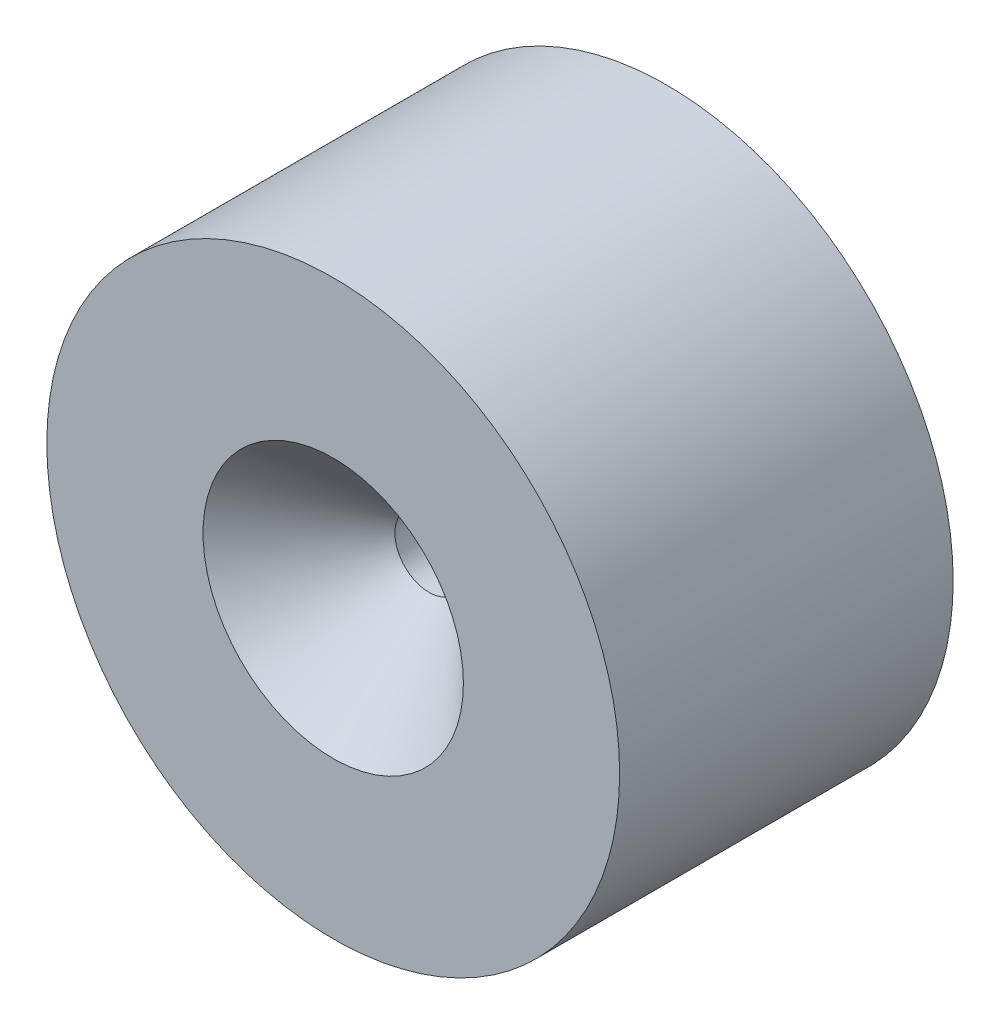
ISO-10303-21;
HEADER;
FILE_DESCRIPTION(('STEP AP214'),'2;1');
FILE_NAME('part.step','',(''),(''),'','','');
FILE_SCHEMA(('AUTOMOTIVE_DESIGN { 1 0 10303 214 1 1 1 1 }'));
ENDSEC;
DATA;
#1=APPLICATION_CONTEXT('core data for automotive mechanical design processes');
#2=APPLICATION_PROTOCOL_DEFINITION('international standard','automotive_design',2000,#1);
#3=PRODUCT_CONTEXT('',#1,'mechanical');
#4=PRODUCT('Part','Part','',(#3));
#5=PRODUCT_RELATED_PRODUCT_CATEGORY('part','',(#4));
#6=PRODUCT_DEFINITION_FORMATION('','',#4);
#7=PRODUCT_DEFINITION_CONTEXT('part definition',#1,'design');
#8=PRODUCT_DEFINITION('design','',#6,#7);
#9=PRODUCT_DEFINITION_SHAPE('','',#8);
#10=(LENGTH_UNIT() NAMED_UNIT(*) SI_UNIT(.MILLI.,.METRE.));
#11=(NAMED_UNIT(*) PLANE_ANGLE_UNIT() SI_UNIT($,.RADIAN.));
#12=(NAMED_UNIT(*) SI_UNIT($,.STERADIAN.) SOLID_ANGLE_UNIT());
#13=UNCERTAINTY_MEASURE_WITH_UNIT(LENGTH_MEASURE(1.E-05),#10,'distance_accuracy_value','');
#14=(GEOMETRIC_REPRESENTATION_CONTEXT(3) GLOBAL_UNCERTAINTY_ASSIGNED_CONTEXT((#13)) GLOBAL_UNIT_ASSIGNED_CONTEXT((#10,
#11,#12)) REPRESENTATION_CONTEXT('',''));
#15=CARTESIAN_POINT('',(0.,0.,0.));
#16=DIRECTION('',(0.,0.,1.));
#17=DIRECTION('',(1.,0.,0.));
#18=AXIS2_PLACEMENT_3D('',#15,#16,#17);
#19=CARTESIAN_POINT('',(0.,0.,30.9118));
#20=DIRECTION('',(0.,0.,-1.));
#21=DIRECTION('',(-1.,0.,0.));
#22=AXIS2_PLACEMENT_3D('',#19,#20,#21);
#23=CYLINDRICAL_SURFACE('',#22,26.543);
#24=CARTESIAN_POINT('',(0.,0.,30.9118));
#25=DIRECTION('',(0.,0.,1.));
#26=DIRECTION('',(1.,0.,0.));
#27=AXIS2_PLACEMENT_3D('',#24,#25,#26);
#28=CIRCLE('',#27,26.543);
#29=CARTESIAN_POINT('',(26.543,0.,30.9118));
#30=VERTEX_POINT('',#29);
#31=EDGE_CURVE('E10',#30,#30,#28,.T.);
#32=ORIENTED_EDGE('',*,*,#31,.F.);
#33=EDGE_LOOP('',(#32));
#34=FACE_BOUND('',#33,.T.);
#35=CARTESIAN_POINT('',(0.,0.,0.));
#36=DIRECTION('',(0.,0.,1.));
#37=DIRECTION('',(1.,0.,0.));
#38=AXIS2_PLACEMENT_3D('',#35,#36,#37);
#39=CIRCLE('',#38,26.543);
#40=CARTESIAN_POINT('',(26.543,0.,0.));
#41=VERTEX_POINT('',#40);
#42=EDGE_CURVE('E43',#41,#41,#39,.T.);
#43=ORIENTED_EDGE('',*,*,#42,.T.);
#44=EDGE_LOOP('',(#43));
#45=FACE_BOUND('',#44,.T.);
#46=ADVANCED_FACE('F40',(#34,#45),#23,.T.);
#47=CARTESIAN_POINT('',(0.,0.,30.9118));
#48=DIRECTION('',(0.,0.,1.));
#49=DIRECTION('',(1.,0.,0.));
#50=AXIS2_PLACEMENT_3D('',#47,#48,#49);
#51=PLANE('',#50);
#52=CARTESIAN_POINT('',(0.,0.,30.9118));
#53=DIRECTION('',(0.,0.,-1.));
#54=DIRECTION('',(-1.,0.,0.));
#55=AXIS2_PLACEMENT_3D('',#52,#53,#54);
#56=CIRCLE('',#55,12.065);
#57=CARTESIAN_POINT('',(12.065,0.,30.9118));
#58=VERTEX_POINT('',#57);
#59=EDGE_CURVE('E52',#58,#58,#56,.T.);
#60=ORIENTED_EDGE('',*,*,#59,.T.);
#61=EDGE_LOOP('',(#60));
#62=FACE_BOUND('',#61,.T.);
#63=ORIENTED_EDGE('',*,*,#31,.T.);
#64=EDGE_LOOP('',(#63));
#65=FACE_BOUND('',#64,.T.);
#66=ADVANCED_FACE('F76',(#62,#65),#51,.T.);
#67=CARTESIAN_POINT('',(0.,0.,0.));
#68=DIRECTION('',(0.,0.,1.));
#69=DIRECTION('',(1.,0.,0.));
#70=AXIS2_PLACEMENT_3D('',#67,#68,#69);
#71=PLANE('',#70);
#72=CARTESIAN_POINT('',(0.,0.,0.));
#73=DIRECTION('',(0.,0.,-1.));
#74=DIRECTION('',(-1.,0.,0.));
#75=AXIS2_PLACEMENT_3D('',#72,#73,#74);
#76=CIRCLE('',#75,4.7752);
#77=CARTESIAN_POINT('',(-4.7752,0.,0.));
#78=VERTEX_POINT('',#77);
#79=EDGE_CURVE('E65',#78,#78,#76,.T.);
#80=ORIENTED_EDGE('',*,*,#79,.F.);
#81=EDGE_LOOP('',(#80));
#82=FACE_BOUND('',#81,.T.);
#83=ORIENTED_EDGE('',*,*,#42,.F.);
#84=EDGE_LOOP('',(#83));
#85=FACE_BOUND('',#84,.T.);
#86=ADVANCED_FACE('F72',(#82,#85),#71,.F.);
#87=CARTESIAN_POINT('',(0.,0.,22.0218));
#88=DIRECTION('',(0.,0.,1.));
#89=DIRECTION('',(1.,0.,0.));
#90=AXIS2_PLACEMENT_3D('',#87,#88,#89);
#91=CONICAL_SURFACE('',#90,3.175,0.785398163397448);
#92=CARTESIAN_POINT('',(0.,0.,22.0218));
#93=DIRECTION('',(0.,0.,-1.));
#94=DIRECTION('',(-1.,0.,0.));
#95=AXIS2_PLACEMENT_3D('',#92,#93,#94);
#96=CIRCLE('',#95,3.175);
#97=CARTESIAN_POINT('',(3.175,0.,22.0218));
#98=VERTEX_POINT('',#97);
#99=EDGE_CURVE('E57',#98,#98,#96,.T.);
#100=CARTESIAN_POINT('',(12.065,0.,30.9118));
#101=CARTESIAN_POINT('',(11.9723958333333,0.,30.8191958333333));
#102=CARTESIAN_POINT('',(11.8797916666667,0.,30.7265916666667));
#103=CARTESIAN_POINT('',(11.6945833333333,0.,30.5413833333333));
#104=CARTESIAN_POINT('',(11.6019791666667,0.,30.4487791666667));
#105=CARTESIAN_POINT('',(11.4167708333333,0.,30.2635708333333));
#106=CARTESIAN_POINT('',(11.3241666666667,0.,30.1709666666667));
#107=CARTESIAN_POINT('',(11.1389583333333,0.,29.9857583333333));
#108=CARTESIAN_POINT('',(11.0463541666667,0.,29.8931541666667));
#109=CARTESIAN_POINT('',(10.8611458333333,0.,29.7079458333333));
#110=CARTESIAN_POINT('',(10.7685416666667,0.,29.6153416666667));
#111=CARTESIAN_POINT('',(10.5833333333333,0.,29.4301333333333));
#112=CARTESIAN_POINT('',(10.4907291666667,0.,29.3375291666667));
#113=CARTESIAN_POINT('',(10.3055208333333,0.,29.1523208333333));
#114=CARTESIAN_POINT('',(10.2129166666667,0.,29.0597166666667));
#115=CARTESIAN_POINT('',(10.0277083333333,0.,28.8745083333333));
#116=CARTESIAN_POINT('',(9.93510416666667,0.,28.7819041666667));
#117=CARTESIAN_POINT('',(9.74989583333334,0.,28.5966958333333));
#118=CARTESIAN_POINT('',(9.65729166666667,0.,28.5040916666667));
#119=CARTESIAN_POINT('',(9.47208333333334,0.,28.3188833333333));
#120=CARTESIAN_POINT('',(9.37947916666667,0.,28.2262791666667));
#121=CARTESIAN_POINT('',(9.19427083333334,0.,28.0410708333333));
#122=CARTESIAN_POINT('',(9.10166666666667,0.,27.9484666666667));
#123=CARTESIAN_POINT('',(8.91645833333333,0.,27.7632583333333));
#124=CARTESIAN_POINT('',(8.82385416666667,0.,27.6706541666667));
#125=CARTESIAN_POINT('',(8.63864583333334,0.,27.4854458333333));
#126=CARTESIAN_POINT('',(8.54604166666667,0.,27.3928416666667));
#127=CARTESIAN_POINT('',(8.36083333333334,0.,27.2076333333333));
#128=CARTESIAN_POINT('',(8.26822916666667,0.,27.1150291666667));
#129=CARTESIAN_POINT('',(8.08302083333334,0.,26.9298208333333));
#130=CARTESIAN_POINT('',(7.99041666666667,0.,26.8372166666667));
#131=CARTESIAN_POINT('',(7.80520833333333,0.,26.6520083333333));
#132=CARTESIAN_POINT('',(7.71260416666667,0.,26.5594041666667));
#133=CARTESIAN_POINT('',(7.52739583333334,0.,26.3741958333333));
#134=CARTESIAN_POINT('',(7.43479166666667,0.,26.2815916666667));
#135=CARTESIAN_POINT('',(7.24958333333333,0.,26.0963833333333));
#136=CARTESIAN_POINT('',(7.15697916666667,0.,26.0037791666667));
#137=CARTESIAN_POINT('',(6.97177083333334,0.,25.8185708333333));
#138=CARTESIAN_POINT('',(6.87916666666667,0.,25.7259666666667));
#139=CARTESIAN_POINT('',(6.69395833333333,0.,25.5407583333333));
#140=CARTESIAN_POINT('',(6.60135416666667,0.,25.4481541666667));
#141=CARTESIAN_POINT('',(6.41614583333333,0.,25.2629458333333));
#142=CARTESIAN_POINT('',(6.32354166666667,0.,25.1703416666667));
#143=CARTESIAN_POINT('',(6.13833333333333,0.,24.9851333333333));
#144=CARTESIAN_POINT('',(6.04572916666667,0.,24.8925291666667));
#145=CARTESIAN_POINT('',(5.86052083333333,0.,24.7073208333333));
#146=CARTESIAN_POINT('',(5.76791666666667,0.,24.6147166666667));
#147=CARTESIAN_POINT('',(5.58270833333333,0.,24.4295083333333));
#148=CARTESIAN_POINT('',(5.49010416666667,0.,24.3369041666667));
#149=CARTESIAN_POINT('',(5.30489583333333,0.,24.1516958333333));
#150=CARTESIAN_POINT('',(5.21229166666667,0.,24.0590916666667));
#151=CARTESIAN_POINT('',(5.02708333333333,0.,23.8738833333333));
#152=CARTESIAN_POINT('',(4.93447916666667,0.,23.7812791666667));
#153=CARTESIAN_POINT('',(4.74927083333333,0.,23.5960708333333));
#154=CARTESIAN_POINT('',(4.65666666666667,0.,23.5034666666667));
#155=CARTESIAN_POINT('',(4.47145833333333,0.,23.3182583333333));
#156=CARTESIAN_POINT('',(4.37885416666667,0.,23.2256541666667));
#157=CARTESIAN_POINT('',(4.19364583333333,0.,23.0404458333333));
#158=CARTESIAN_POINT('',(4.10104166666667,0.,22.9478416666667));
#159=CARTESIAN_POINT('',(3.91583333333333,0.,22.7626333333333));
#160=CARTESIAN_POINT('',(3.82322916666667,0.,22.6700291666667));
#161=CARTESIAN_POINT('',(3.63802083333333,0.,22.4848208333333));
#162=CARTESIAN_POINT('',(3.54541666666667,0.,22.3922166666667));
#163=CARTESIAN_POINT('',(3.36020833333333,0.,22.2070083333333));
#164=CARTESIAN_POINT('',(3.26760416666667,0.,22.1144041666667));
#165=CARTESIAN_POINT('',(3.175,0.,22.0218));
#166=B_SPLINE_CURVE_WITH_KNOTS('',3,(#100,#101,#102,#103,#104,#105,#106,#107,#108,#109,#110,
#111,#112,#113,#114,#115,#116,#117,#118,#119,#120,#121,#122,#123,#124,#125,#126,#127,#128,#129,
#130,#131,#132,#133,#134,#135,#136,#137,#138,#139,#140,#141,#142,#143,#144,#145,#146,#147,#148,
#149,#150,#151,#152,#153,#154,#155,#156,#157,#158,#159,#160,#161,#162,#163,#164,#165),
.UNSPECIFIED.,.F.,.F.,(4,2,2,2,2,2,2,2,2,2,2,2,2,2,2,2,2,2,2,2,2,2,2,2,2,2,2,2,2,2,2,2,4),(0.,
0.392886205296775,0.785772410593552,1.17865861589033,1.5715448211871,1.96443102648388,
2.35731723178065,2.75020343707743,3.14308964237421,3.53597584767098,3.92886205296776,
4.32174825826453,4.71463446356131,5.10752066885808,5.50040687415486,5.89329307945163,
6.28617928474841,6.67906549004519,7.07195169534196,7.46483790063874,7.85772410593551,
8.25061031123229,8.64349651652907,9.03638272182584,9.42926892712261,9.82215513241939,
10.2150413377162,10.6079275430129,11.0008137483097,11.3936999536065,11.7865861589033,
12.1794723642,12.5723585694968),.UNSPECIFIED.);
#167=EDGE_CURVE('BSEAM75',#58,#98,#166,.T.);
#168=ORIENTED_EDGE('',*,*,#59,.F.);
#169=ORIENTED_EDGE('',*,*,#99,.T.);
#170=ORIENTED_EDGE('',*,*,#167,.T.);
#171=ORIENTED_EDGE('',*,*,#167,.F.);
#172=EDGE_LOOP('',(#168,#170,#169,#171));
#173=FACE_BOUND('',#172,.T.);
#174=ADVANCED_FACE('F75',(#173),#91,.F.);
#175=CARTESIAN_POINT('',(0.,0.,0.));
#176=DIRECTION('',(0.,0.,-1.));
#177=DIRECTION('',(-1.,0.,0.));
#178=AXIS2_PLACEMENT_3D('',#175,#176,#177);
#179=CYLINDRICAL_SURFACE('',#178,3.175);
#180=ORIENTED_EDGE('',*,*,#99,.F.);
#181=EDGE_LOOP('',(#180));
#182=FACE_BOUND('',#181,.T.);
#183=CARTESIAN_POINT('',(0.,0.,18.2118));
#184=DIRECTION('',(0.,0.,-1.));
#185=DIRECTION('',(-1.,0.,0.));
#186=AXIS2_PLACEMENT_3D('',#183,#184,#185);
#187=CIRCLE('',#186,3.175);
#188=CARTESIAN_POINT('',(-3.175,0.,18.2118));
#189=VERTEX_POINT('',#188);
#190=EDGE_CURVE('E61',#189,#189,#187,.T.);
#191=ORIENTED_EDGE('',*,*,#190,.T.);
#192=EDGE_LOOP('',(#191));
#193=FACE_BOUND('',#192,.T.);
#194=ADVANCED_FACE('F91',(#182,#193),#179,.F.);
#195=CARTESIAN_POINT('',(0.,0.,0.));
#196=DIRECTION('',(0.,0.,-1.));
#197=DIRECTION('',(-1.,0.,0.));
#198=AXIS2_PLACEMENT_3D('',#195,#196,#197);
#199=CONICAL_SURFACE('',#198,4.7752,0.0876410284470484);
#200=ORIENTED_EDGE('',*,*,#190,.F.);
#201=EDGE_LOOP('',(#200));
#202=FACE_BOUND('',#201,.T.);
#203=ORIENTED_EDGE('',*,*,#79,.T.);
#204=EDGE_LOOP('',(#203));
#205=FACE_BOUND('',#204,.T.);
#206=ADVANCED_FACE('F70',(#202,#205),#199,.F.);
#207=CLOSED_SHELL('',(#46,#66,#86,#174,#194,#206));
#208=MANIFOLD_SOLID_BREP('B2',#207);
#209=ADVANCED_BREP_SHAPE_REPRESENTATION('',(#18,#208),#14);
#210=SHAPE_DEFINITION_REPRESENTATION(#9,#209);
ENDSEC;
END-ISO-10303-21;
